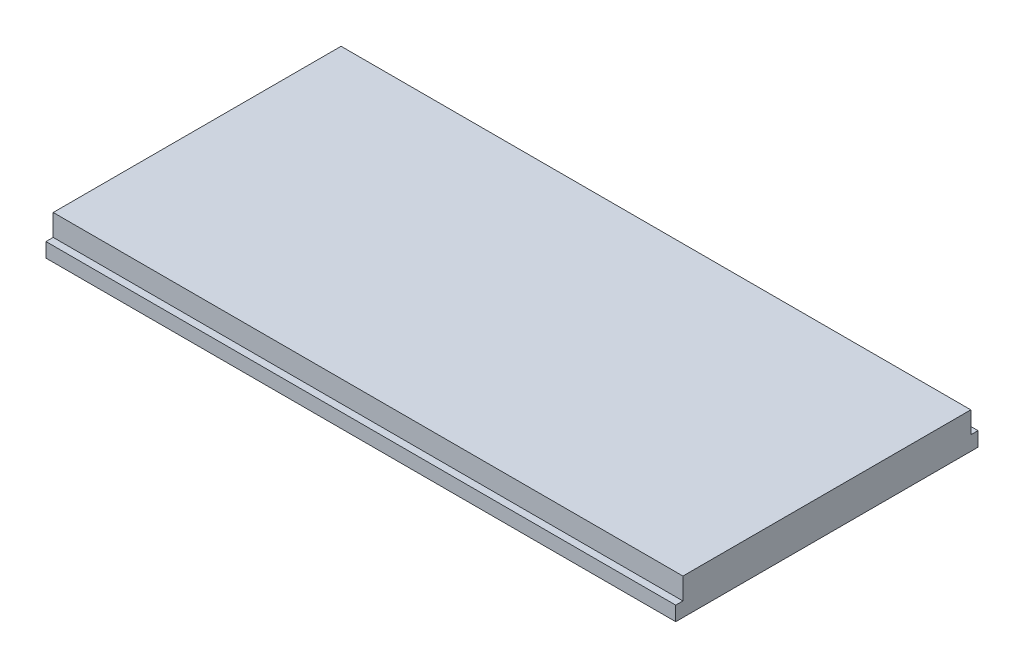
ISO-10303-21;
HEADER;
FILE_DESCRIPTION(('STEP AP214'),'2;1');
FILE_NAME('part.step','',(''),(''),'','','');
FILE_SCHEMA(('AUTOMOTIVE_DESIGN { 1 0 10303 214 1 1 1 1 }'));
ENDSEC;
DATA;
#1=APPLICATION_CONTEXT('core data for automotive mechanical design processes');
#2=APPLICATION_PROTOCOL_DEFINITION('international standard','automotive_design',2000,#1);
#3=PRODUCT_CONTEXT('',#1,'mechanical');
#4=PRODUCT('Part','Part','',(#3));
#5=PRODUCT_RELATED_PRODUCT_CATEGORY('part','',(#4));
#6=PRODUCT_DEFINITION_FORMATION('','',#4);
#7=PRODUCT_DEFINITION_CONTEXT('part definition',#1,'design');
#8=PRODUCT_DEFINITION('design','',#6,#7);
#9=PRODUCT_DEFINITION_SHAPE('','',#8);
#10=(LENGTH_UNIT() NAMED_UNIT(*) SI_UNIT(.MILLI.,.METRE.));
#11=(NAMED_UNIT(*) PLANE_ANGLE_UNIT() SI_UNIT($,.RADIAN.));
#12=(NAMED_UNIT(*) SI_UNIT($,.STERADIAN.) SOLID_ANGLE_UNIT());
#13=UNCERTAINTY_MEASURE_WITH_UNIT(LENGTH_MEASURE(1.E-05),#10,'distance_accuracy_value','');
#14=(GEOMETRIC_REPRESENTATION_CONTEXT(3) GLOBAL_UNCERTAINTY_ASSIGNED_CONTEXT((#13)) GLOBAL_UNIT_ASSIGNED_CONTEXT((#10,
#11,#12)) REPRESENTATION_CONTEXT('',''));
#15=CARTESIAN_POINT('',(0.,0.,0.));
#16=DIRECTION('',(0.,0.,1.));
#17=DIRECTION('',(1.,0.,0.));
#18=AXIS2_PLACEMENT_3D('',#15,#16,#17);
#19=CARTESIAN_POINT('',(43.75,5.,-21.));
#20=DIRECTION('',(-1.,0.,0.));
#21=DIRECTION('',(0.,0.,1.));
#22=AXIS2_PLACEMENT_3D('',#19,#20,#21);
#23=PLANE('',#22);
#24=DIRECTION('',(0.,0.,-1.));
#25=VECTOR('',#24,1.);
#26=CARTESIAN_POINT('',(43.75,5.,-21.));
#27=LINE('',#26,#25);
#28=CARTESIAN_POINT('',(43.75,5.,20.));
#29=VERTEX_POINT('',#28);
#30=CARTESIAN_POINT('',(43.75,5.,-20.));
#31=VERTEX_POINT('',#30);
#32=EDGE_CURVE('E129',#29,#31,#27,.T.);
#33=ORIENTED_EDGE('',*,*,#32,.F.);
#34=DIRECTION('',(0.,1.,0.));
#35=VECTOR('',#34,1.);
#36=CARTESIAN_POINT('',(43.75,2.,20.));
#37=LINE('',#36,#35);
#38=CARTESIAN_POINT('',(43.75,2.,20.));
#39=VERTEX_POINT('',#38);
#40=EDGE_CURVE('E47',#39,#29,#37,.T.);
#41=ORIENTED_EDGE('',*,*,#40,.F.);
#42=DIRECTION('',(0.,0.,-1.));
#43=VECTOR('',#42,1.);
#44=CARTESIAN_POINT('',(43.75,2.,21.));
#45=LINE('',#44,#43);
#46=CARTESIAN_POINT('',(43.75,2.,21.));
#47=VERTEX_POINT('',#46);
#48=EDGE_CURVE('E117',#47,#39,#45,.T.);
#49=ORIENTED_EDGE('',*,*,#48,.F.);
#50=DIRECTION('',(0.,-1.,0.));
#51=VECTOR('',#50,1.);
#52=CARTESIAN_POINT('',(43.75,5.,21.));
#53=LINE('',#52,#51);
#54=CARTESIAN_POINT('',(43.75,0.,21.));
#55=VERTEX_POINT('',#54);
#56=EDGE_CURVE('E116',#47,#55,#53,.T.);
#57=ORIENTED_EDGE('',*,*,#56,.T.);
#58=DIRECTION('',(0.,0.,-1.));
#59=VECTOR('',#58,1.);
#60=CARTESIAN_POINT('',(43.75,0.,-21.));
#61=LINE('',#60,#59);
#62=CARTESIAN_POINT('',(43.75,0.,-21.));
#63=VERTEX_POINT('',#62);
#64=EDGE_CURVE('E134',#55,#63,#61,.T.);
#65=ORIENTED_EDGE('',*,*,#64,.T.);
#66=DIRECTION('',(0.,-1.,0.));
#67=VECTOR('',#66,1.);
#68=CARTESIAN_POINT('',(43.75,5.,-21.));
#69=LINE('',#68,#67);
#70=CARTESIAN_POINT('',(43.75,2.,-21.));
#71=VERTEX_POINT('',#70);
#72=EDGE_CURVE('E11',#71,#63,#69,.T.);
#73=ORIENTED_EDGE('',*,*,#72,.F.);
#74=DIRECTION('',(0.,0.,-1.));
#75=VECTOR('',#74,1.);
#76=CARTESIAN_POINT('',(43.75,2.,-21.));
#77=LINE('',#76,#75);
#78=CARTESIAN_POINT('',(43.75,2.,-20.));
#79=VERTEX_POINT('',#78);
#80=EDGE_CURVE('E147',#79,#71,#77,.T.);
#81=ORIENTED_EDGE('',*,*,#80,.F.);
#82=DIRECTION('',(0.,1.,0.));
#83=VECTOR('',#82,1.);
#84=CARTESIAN_POINT('',(43.75,2.,-20.));
#85=LINE('',#84,#83);
#86=EDGE_CURVE('E137',#79,#31,#85,.T.);
#87=ORIENTED_EDGE('',*,*,#86,.T.);
#88=EDGE_LOOP('',(#33,#41,#49,#57,#65,#73,#81,#87));
#89=FACE_BOUND('',#88,.T.);
#90=ADVANCED_FACE('F33',(#89),#23,.F.);
#91=CARTESIAN_POINT('',(-43.75,5.,-21.));
#92=DIRECTION('',(0.,0.,1.));
#93=DIRECTION('',(1.,0.,0.));
#94=AXIS2_PLACEMENT_3D('',#91,#92,#93);
#95=PLANE('',#94);
#96=DIRECTION('',(0.,-1.,0.));
#97=VECTOR('',#96,1.);
#98=CARTESIAN_POINT('',(-43.75,5.,-21.));
#99=LINE('',#98,#97);
#100=CARTESIAN_POINT('',(-43.75,2.,-21.));
#101=VERTEX_POINT('',#100);
#102=CARTESIAN_POINT('',(-43.75,0.,-21.));
#103=VERTEX_POINT('',#102);
#104=EDGE_CURVE('E40',#101,#103,#99,.T.);
#105=ORIENTED_EDGE('',*,*,#104,.F.);
#106=DIRECTION('',(-1.,0.,0.));
#107=VECTOR('',#106,1.);
#108=CARTESIAN_POINT('',(43.75,2.,-21.));
#109=LINE('',#108,#107);
#110=EDGE_CURVE('E153',#71,#101,#109,.T.);
#111=ORIENTED_EDGE('',*,*,#110,.F.);
#112=ORIENTED_EDGE('',*,*,#72,.T.);
#113=DIRECTION('',(-1.,0.,0.));
#114=VECTOR('',#113,1.);
#115=CARTESIAN_POINT('',(-43.75,0.,-21.));
#116=LINE('',#115,#114);
#117=EDGE_CURVE('E131',#63,#103,#116,.T.);
#118=ORIENTED_EDGE('',*,*,#117,.T.);
#119=EDGE_LOOP('',(#105,#111,#112,#118));
#120=FACE_BOUND('',#119,.T.);
#121=ADVANCED_FACE('F177',(#120),#95,.F.);
#122=CARTESIAN_POINT('',(-43.75,5.,-21.));
#123=DIRECTION('',(1.,0.,0.));
#124=DIRECTION('',(0.,0.,-1.));
#125=AXIS2_PLACEMENT_3D('',#122,#123,#124);
#126=PLANE('',#125);
#127=DIRECTION('',(0.,0.,1.));
#128=VECTOR('',#127,1.);
#129=CARTESIAN_POINT('',(-43.75,2.,21.));
#130=LINE('',#129,#128);
#131=CARTESIAN_POINT('',(-43.75,2.,20.));
#132=VERTEX_POINT('',#131);
#133=CARTESIAN_POINT('',(-43.75,2.,21.));
#134=VERTEX_POINT('',#133);
#135=EDGE_CURVE('E99',#132,#134,#130,.T.);
#136=ORIENTED_EDGE('',*,*,#135,.F.);
#137=DIRECTION('',(0.,1.,0.));
#138=VECTOR('',#137,1.);
#139=CARTESIAN_POINT('',(-43.75,2.,20.));
#140=LINE('',#139,#138);
#141=CARTESIAN_POINT('',(-43.75,5.,20.));
#142=VERTEX_POINT('',#141);
#143=EDGE_CURVE('E148',#132,#142,#140,.T.);
#144=ORIENTED_EDGE('',*,*,#143,.T.);
#145=DIRECTION('',(0.,0.,1.));
#146=VECTOR('',#145,1.);
#147=CARTESIAN_POINT('',(-43.75,5.,-21.));
#148=LINE('',#147,#146);
#149=CARTESIAN_POINT('',(-43.75,5.,-20.));
#150=VERTEX_POINT('',#149);
#151=EDGE_CURVE('E124',#150,#142,#148,.T.);
#152=ORIENTED_EDGE('',*,*,#151,.F.);
#153=DIRECTION('',(0.,1.,0.));
#154=VECTOR('',#153,1.);
#155=CARTESIAN_POINT('',(-43.75,2.,-20.));
#156=LINE('',#155,#154);
#157=CARTESIAN_POINT('',(-43.75,2.,-20.));
#158=VERTEX_POINT('',#157);
#159=EDGE_CURVE('E55',#158,#150,#156,.T.);
#160=ORIENTED_EDGE('',*,*,#159,.F.);
#161=DIRECTION('',(0.,0.,1.));
#162=VECTOR('',#161,1.);
#163=CARTESIAN_POINT('',(-43.75,2.,-21.));
#164=LINE('',#163,#162);
#165=EDGE_CURVE('E151',#101,#158,#164,.T.);
#166=ORIENTED_EDGE('',*,*,#165,.F.);
#167=ORIENTED_EDGE('',*,*,#104,.T.);
#168=DIRECTION('',(0.,0.,1.));
#169=VECTOR('',#168,1.);
#170=CARTESIAN_POINT('',(-43.75,0.,-21.));
#171=LINE('',#170,#169);
#172=CARTESIAN_POINT('',(-43.75,0.,21.));
#173=VERTEX_POINT('',#172);
#174=EDGE_CURVE('E121',#103,#173,#171,.T.);
#175=ORIENTED_EDGE('',*,*,#174,.T.);
#176=DIRECTION('',(0.,-1.,0.));
#177=VECTOR('',#176,1.);
#178=CARTESIAN_POINT('',(-43.75,5.,21.));
#179=LINE('',#178,#177);
#180=EDGE_CURVE('E114',#134,#173,#179,.T.);
#181=ORIENTED_EDGE('',*,*,#180,.F.);
#182=EDGE_LOOP('',(#136,#144,#152,#160,#166,#167,#175,#181));
#183=FACE_BOUND('',#182,.T.);
#184=ADVANCED_FACE('F119',(#183),#126,.F.);
#185=CARTESIAN_POINT('',(-43.75,5.,21.));
#186=DIRECTION('',(0.,0.,-1.));
#187=DIRECTION('',(-1.,0.,0.));
#188=AXIS2_PLACEMENT_3D('',#185,#186,#187);
#189=PLANE('',#188);
#190=ORIENTED_EDGE('',*,*,#56,.F.);
#191=DIRECTION('',(1.,0.,0.));
#192=VECTOR('',#191,1.);
#193=CARTESIAN_POINT('',(-43.75,2.,21.));
#194=LINE('',#193,#192);
#195=EDGE_CURVE('E102',#134,#47,#194,.T.);
#196=ORIENTED_EDGE('',*,*,#195,.F.);
#197=ORIENTED_EDGE('',*,*,#180,.T.);
#198=DIRECTION('',(1.,0.,0.));
#199=VECTOR('',#198,1.);
#200=CARTESIAN_POINT('',(-43.75,0.,21.));
#201=LINE('',#200,#199);
#202=EDGE_CURVE('E127',#173,#55,#201,.T.);
#203=ORIENTED_EDGE('',*,*,#202,.T.);
#204=EDGE_LOOP('',(#190,#196,#197,#203));
#205=FACE_BOUND('',#204,.T.);
#206=ADVANCED_FACE('F112',(#205),#189,.F.);
#207=CARTESIAN_POINT('',(0.,5.,0.));
#208=DIRECTION('',(0.,1.,0.));
#209=DIRECTION('',(0.,0.,1.));
#210=AXIS2_PLACEMENT_3D('',#207,#208,#209);
#211=PLANE('',#210);
#212=DIRECTION('',(-1.,0.,0.));
#213=VECTOR('',#212,1.);
#214=CARTESIAN_POINT('',(-43.75,5.,20.));
#215=LINE('',#214,#213);
#216=EDGE_CURVE('E108',#29,#142,#215,.T.);
#217=ORIENTED_EDGE('',*,*,#216,.F.);
#218=ORIENTED_EDGE('',*,*,#32,.T.);
#219=DIRECTION('',(1.,0.,0.));
#220=VECTOR('',#219,1.);
#221=CARTESIAN_POINT('',(43.75,5.,-20.));
#222=LINE('',#221,#220);
#223=EDGE_CURVE('E145',#150,#31,#222,.T.);
#224=ORIENTED_EDGE('',*,*,#223,.F.);
#225=ORIENTED_EDGE('',*,*,#151,.T.);
#226=EDGE_LOOP('',(#217,#218,#224,#225));
#227=FACE_BOUND('',#226,.T.);
#228=ADVANCED_FACE('F165',(#227),#211,.T.);
#229=CARTESIAN_POINT('',(0.,0.,0.));
#230=DIRECTION('',(0.,1.,0.));
#231=DIRECTION('',(0.,0.,1.));
#232=AXIS2_PLACEMENT_3D('',#229,#230,#231);
#233=PLANE('',#232);
#234=ORIENTED_EDGE('',*,*,#64,.F.);
#235=ORIENTED_EDGE('',*,*,#202,.F.);
#236=ORIENTED_EDGE('',*,*,#174,.F.);
#237=ORIENTED_EDGE('',*,*,#117,.F.);
#238=EDGE_LOOP('',(#234,#235,#236,#237));
#239=FACE_BOUND('',#238,.T.);
#240=ADVANCED_FACE('F179',(#239),#233,.F.);
#241=CARTESIAN_POINT('',(43.75,2.,-20.));
#242=DIRECTION('',(0.,0.,1.));
#243=DIRECTION('',(1.,0.,0.));
#244=AXIS2_PLACEMENT_3D('',#241,#242,#243);
#245=PLANE('',#244);
#246=ORIENTED_EDGE('',*,*,#223,.T.);
#247=ORIENTED_EDGE('',*,*,#86,.F.);
#248=DIRECTION('',(1.,0.,0.));
#249=VECTOR('',#248,1.);
#250=CARTESIAN_POINT('',(43.75,2.,-20.));
#251=LINE('',#250,#249);
#252=EDGE_CURVE('E142',#158,#79,#251,.T.);
#253=ORIENTED_EDGE('',*,*,#252,.F.);
#254=ORIENTED_EDGE('',*,*,#159,.T.);
#255=EDGE_LOOP('',(#246,#247,#253,#254));
#256=FACE_BOUND('',#255,.T.);
#257=ADVANCED_FACE('F167',(#256),#245,.F.);
#258=CARTESIAN_POINT('',(0.,2.,0.));
#259=DIRECTION('',(0.,-1.,0.));
#260=DIRECTION('',(0.,0.,-1.));
#261=AXIS2_PLACEMENT_3D('',#258,#259,#260);
#262=PLANE('',#261);
#263=ORIENTED_EDGE('',*,*,#80,.T.);
#264=ORIENTED_EDGE('',*,*,#110,.T.);
#265=ORIENTED_EDGE('',*,*,#165,.T.);
#266=ORIENTED_EDGE('',*,*,#252,.T.);
#267=EDGE_LOOP('',(#263,#264,#265,#266));
#268=FACE_BOUND('',#267,.T.);
#269=ADVANCED_FACE('F169',(#268),#262,.F.);
#270=CARTESIAN_POINT('',(-43.75,2.,20.));
#271=DIRECTION('',(0.,0.,-1.));
#272=DIRECTION('',(-1.,0.,0.));
#273=AXIS2_PLACEMENT_3D('',#270,#271,#272);
#274=PLANE('',#273);
#275=ORIENTED_EDGE('',*,*,#216,.T.);
#276=ORIENTED_EDGE('',*,*,#143,.F.);
#277=DIRECTION('',(-1.,0.,0.));
#278=VECTOR('',#277,1.);
#279=CARTESIAN_POINT('',(-43.75,2.,20.));
#280=LINE('',#279,#278);
#281=EDGE_CURVE('E104',#39,#132,#280,.T.);
#282=ORIENTED_EDGE('',*,*,#281,.F.);
#283=ORIENTED_EDGE('',*,*,#40,.T.);
#284=EDGE_LOOP('',(#275,#276,#282,#283));
#285=FACE_BOUND('',#284,.T.);
#286=ADVANCED_FACE('F161',(#285),#274,.F.);
#287=CARTESIAN_POINT('',(0.,2.,0.));
#288=DIRECTION('',(0.,-1.,0.));
#289=DIRECTION('',(0.,0.,-1.));
#290=AXIS2_PLACEMENT_3D('',#287,#288,#289);
#291=PLANE('',#290);
#292=ORIENTED_EDGE('',*,*,#135,.T.);
#293=ORIENTED_EDGE('',*,*,#195,.T.);
#294=ORIENTED_EDGE('',*,*,#48,.T.);
#295=ORIENTED_EDGE('',*,*,#281,.T.);
#296=EDGE_LOOP('',(#292,#293,#294,#295));
#297=FACE_BOUND('',#296,.T.);
#298=ADVANCED_FACE('F101',(#297),#291,.F.);
#299=CLOSED_SHELL('',(#90,#121,#184,#206,#228,#240,#257,#269,#286,#298));
#300=MANIFOLD_SOLID_BREP('B2',#299);
#301=ADVANCED_BREP_SHAPE_REPRESENTATION('',(#18,#300),#14);
#302=SHAPE_DEFINITION_REPRESENTATION(#9,#301);
ENDSEC;
END-ISO-10303-21;
